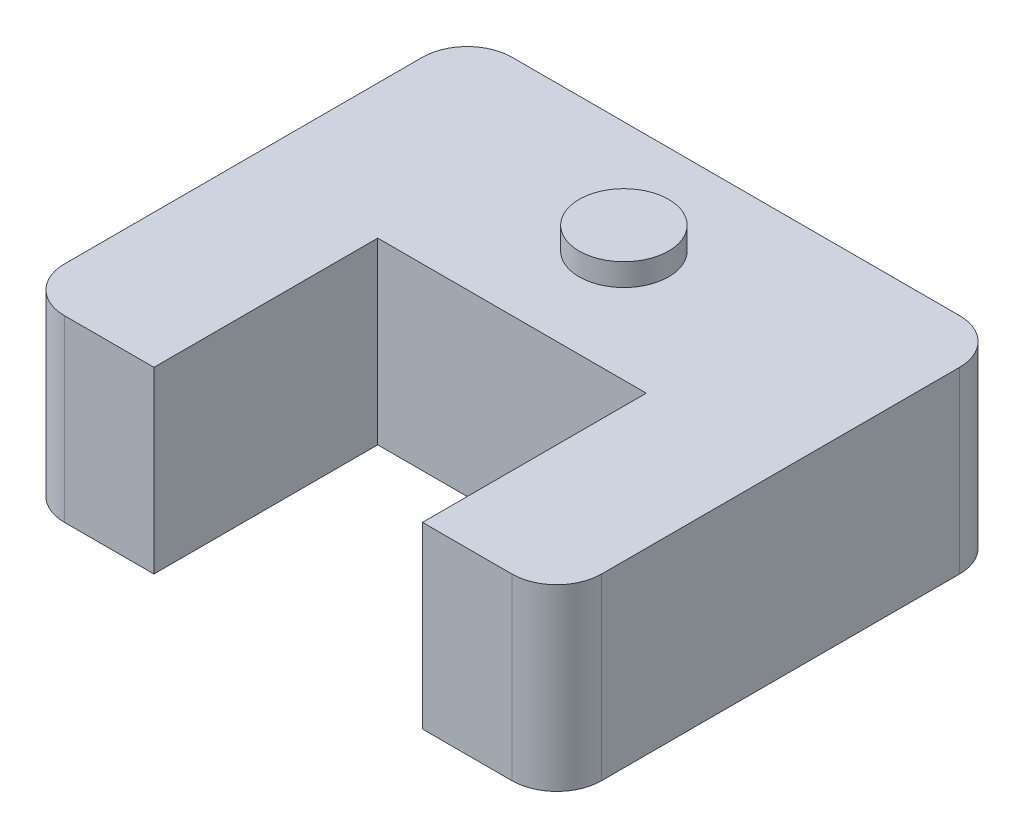
ISO-10303-21;
HEADER;
FILE_DESCRIPTION(('STEP AP214'),'2;1');
FILE_NAME('part.step','',(''),(''),'','','');
FILE_SCHEMA(('AUTOMOTIVE_DESIGN { 1 0 10303 214 1 1 1 1 }'));
ENDSEC;
DATA;
#1=APPLICATION_CONTEXT('core data for automotive mechanical design processes');
#2=APPLICATION_PROTOCOL_DEFINITION('international standard','automotive_design',2000,#1);
#3=PRODUCT_CONTEXT('',#1,'mechanical');
#4=PRODUCT('Part','Part','',(#3));
#5=PRODUCT_RELATED_PRODUCT_CATEGORY('part','',(#4));
#6=PRODUCT_DEFINITION_FORMATION('','',#4);
#7=PRODUCT_DEFINITION_CONTEXT('part definition',#1,'design');
#8=PRODUCT_DEFINITION('design','',#6,#7);
#9=PRODUCT_DEFINITION_SHAPE('','',#8);
#10=(LENGTH_UNIT() NAMED_UNIT(*) SI_UNIT(.MILLI.,.METRE.));
#11=(NAMED_UNIT(*) PLANE_ANGLE_UNIT() SI_UNIT($,.RADIAN.));
#12=(NAMED_UNIT(*) SI_UNIT($,.STERADIAN.) SOLID_ANGLE_UNIT());
#13=UNCERTAINTY_MEASURE_WITH_UNIT(LENGTH_MEASURE(1.E-05),#10,'distance_accuracy_value','');
#14=(GEOMETRIC_REPRESENTATION_CONTEXT(3) GLOBAL_UNCERTAINTY_ASSIGNED_CONTEXT((#13)) GLOBAL_UNIT_ASSIGNED_CONTEXT((#10,
#11,#12)) REPRESENTATION_CONTEXT('',''));
#15=CARTESIAN_POINT('',(0.,0.,0.));
#16=DIRECTION('',(0.,0.,1.));
#17=DIRECTION('',(1.,0.,0.));
#18=AXIS2_PLACEMENT_3D('',#15,#16,#17);
#19=CARTESIAN_POINT('',(0.,0.,0.));
#20=DIRECTION('',(0.,0.,-1.));
#21=DIRECTION('',(-1.,0.,0.));
#22=AXIS2_PLACEMENT_3D('',#19,#20,#21);
#23=PLANE('',#22);
#24=DIRECTION('',(-1.,0.,0.));
#25=VECTOR('',#24,1.);
#26=CARTESIAN_POINT('',(0.,101.6,0.));
#27=LINE('',#26,#25);
#28=CARTESIAN_POINT('',(-228.6,101.6,0.));
#29=VERTEX_POINT('',#28);
#30=CARTESIAN_POINT('',(-279.4,101.6,0.));
#31=VERTEX_POINT('',#30);
#32=EDGE_CURVE('E167',#29,#31,#27,.T.);
#33=ORIENTED_EDGE('',*,*,#32,.T.);
#34=DIRECTION('',(0.,1.,0.));
#35=VECTOR('',#34,1.);
#36=CARTESIAN_POINT('',(-279.4,0.,0.));
#37=LINE('',#36,#35);
#38=CARTESIAN_POINT('',(-279.4,0.,0.));
#39=VERTEX_POINT('',#38);
#40=EDGE_CURVE('E43',#31,#39,#37,.F.);
#41=ORIENTED_EDGE('',*,*,#40,.T.);
#42=DIRECTION('',(-1.,0.,0.));
#43=VECTOR('',#42,1.);
#44=CARTESIAN_POINT('',(0.,0.,0.));
#45=LINE('',#44,#43);
#46=CARTESIAN_POINT('',(-228.6,0.,0.));
#47=VERTEX_POINT('',#46);
#48=EDGE_CURVE('E182',#47,#39,#45,.T.);
#49=ORIENTED_EDGE('',*,*,#48,.F.);
#50=DIRECTION('',(0.,-1.,0.));
#51=VECTOR('',#50,1.);
#52=CARTESIAN_POINT('',(-228.6,0.,0.));
#53=LINE('',#52,#51);
#54=EDGE_CURVE('E136',#29,#47,#53,.T.);
#55=ORIENTED_EDGE('',*,*,#54,.F.);
#56=EDGE_LOOP('',(#33,#41,#49,#55));
#57=FACE_BOUND('',#56,.T.);
#58=ADVANCED_FACE('F39',(#57),#23,.F.);
#59=CARTESIAN_POINT('',(0.,101.6,-254.));
#60=DIRECTION('',(0.,1.,0.));
#61=DIRECTION('',(0.,0.,1.));
#62=AXIS2_PLACEMENT_3D('',#59,#60,#61);
#63=PLANE('',#62);
#64=CARTESIAN_POINT('',(-152.4,101.6,-190.5));
#65=DIRECTION('',(0.,1.,0.));
#66=DIRECTION('',(0.,0.,1.));
#67=AXIS2_PLACEMENT_3D('',#64,#65,#66);
#68=CIRCLE('',#67,25.4);
#69=CARTESIAN_POINT('',(-152.4,101.6,-165.1));
#70=VERTEX_POINT('',#69);
#71=EDGE_CURVE('E11',#70,#70,#68,.T.);
#72=ORIENTED_EDGE('',*,*,#71,.F.);
#73=EDGE_LOOP('',(#72));
#74=FACE_BOUND('',#73,.T.);
#75=DIRECTION('',(-1.,0.,0.));
#76=VECTOR('',#75,1.);
#77=CARTESIAN_POINT('',(0.,101.6,-254.));
#78=LINE('',#77,#76);
#79=CARTESIAN_POINT('',(-25.4,101.6,-254.));
#80=VERTEX_POINT('',#79);
#81=CARTESIAN_POINT('',(-279.4,101.6,-254.));
#82=VERTEX_POINT('',#81);
#83=EDGE_CURVE('E172',#80,#82,#78,.T.);
#84=ORIENTED_EDGE('',*,*,#83,.T.);
#85=CARTESIAN_POINT('',(-279.4,101.6,-228.6));
#86=DIRECTION('',(0.,1.,0.));
#87=DIRECTION('',(0.,0.,1.));
#88=AXIS2_PLACEMENT_3D('',#85,#86,#87);
#89=CIRCLE('',#88,25.4);
#90=CARTESIAN_POINT('',(-304.8,101.6,-228.6));
#91=VERTEX_POINT('',#90);
#92=EDGE_CURVE('E204',#82,#91,#89,.T.);
#93=ORIENTED_EDGE('',*,*,#92,.T.);
#94=DIRECTION('',(0.,0.,1.));
#95=VECTOR('',#94,1.);
#96=CARTESIAN_POINT('',(-304.8,101.6,-254.));
#97=LINE('',#96,#95);
#98=CARTESIAN_POINT('',(-304.8,101.6,-25.4));
#99=VERTEX_POINT('',#98);
#100=EDGE_CURVE('E179',#91,#99,#97,.T.);
#101=ORIENTED_EDGE('',*,*,#100,.T.);
#102=CARTESIAN_POINT('',(-279.4,101.6,-25.4));
#103=DIRECTION('',(0.,1.,0.));
#104=DIRECTION('',(0.,0.,1.));
#105=AXIS2_PLACEMENT_3D('',#102,#103,#104);
#106=CIRCLE('',#105,25.4);
#107=EDGE_CURVE('E198',#99,#31,#106,.T.);
#108=ORIENTED_EDGE('',*,*,#107,.T.);
#109=ORIENTED_EDGE('',*,*,#32,.F.);
#110=DIRECTION('',(0.,0.,1.));
#111=VECTOR('',#110,1.);
#112=CARTESIAN_POINT('',(-228.6,101.6,-127.));
#113=LINE('',#112,#111);
#114=CARTESIAN_POINT('',(-228.6,101.6,-127.));
#115=VERTEX_POINT('',#114);
#116=EDGE_CURVE('E165',#115,#29,#113,.T.);
#117=ORIENTED_EDGE('',*,*,#116,.F.);
#118=DIRECTION('',(-1.,0.,0.));
#119=VECTOR('',#118,1.);
#120=CARTESIAN_POINT('',(-228.6,101.6,-127.));
#121=LINE('',#120,#119);
#122=CARTESIAN_POINT('',(-76.2,101.6,-127.));
#123=VERTEX_POINT('',#122);
#124=EDGE_CURVE('E141',#123,#115,#121,.T.);
#125=ORIENTED_EDGE('',*,*,#124,.F.);
#126=DIRECTION('',(0.,0.,1.));
#127=VECTOR('',#126,1.);
#128=CARTESIAN_POINT('',(-76.2,101.6,-127.));
#129=LINE('',#128,#127);
#130=CARTESIAN_POINT('',(-76.2,101.6,0.));
#131=VERTEX_POINT('',#130);
#132=EDGE_CURVE('E168',#123,#131,#129,.T.);
#133=ORIENTED_EDGE('',*,*,#132,.T.);
#134=CARTESIAN_POINT('',(-25.4,101.6,0.));
#135=VERTEX_POINT('',#134);
#136=EDGE_CURVE('E180',#135,#131,#27,.T.);
#137=ORIENTED_EDGE('',*,*,#136,.F.);
#138=CARTESIAN_POINT('',(-25.4,101.6,-25.4));
#139=DIRECTION('',(0.,1.,0.));
#140=DIRECTION('',(0.,0.,1.));
#141=AXIS2_PLACEMENT_3D('',#138,#139,#140);
#142=CIRCLE('',#141,25.4);
#143=CARTESIAN_POINT('',(0.,101.6,-25.4));
#144=VERTEX_POINT('',#143);
#145=EDGE_CURVE('E200',#135,#144,#142,.T.);
#146=ORIENTED_EDGE('',*,*,#145,.T.);
#147=DIRECTION('',(0.,0.,1.));
#148=VECTOR('',#147,1.);
#149=CARTESIAN_POINT('',(0.,101.6,-254.));
#150=LINE('',#149,#148);
#151=CARTESIAN_POINT('',(0.,101.6,-228.6));
#152=VERTEX_POINT('',#151);
#153=EDGE_CURVE('E184',#152,#144,#150,.T.);
#154=ORIENTED_EDGE('',*,*,#153,.F.);
#155=CARTESIAN_POINT('',(-25.4,101.6,-228.6));
#156=DIRECTION('',(0.,1.,0.));
#157=DIRECTION('',(0.,0.,1.));
#158=AXIS2_PLACEMENT_3D('',#155,#156,#157);
#159=CIRCLE('',#158,25.4);
#160=EDGE_CURVE('E202',#152,#80,#159,.T.);
#161=ORIENTED_EDGE('',*,*,#160,.T.);
#162=EDGE_LOOP('',(#84,#93,#101,#108,#109,#117,#125,#133,#137,#146,#154,#161));
#163=FACE_BOUND('',#162,.T.);
#164=ADVANCED_FACE('F238',(#74,#163),#63,.T.);
#165=CARTESIAN_POINT('',(0.,0.,-254.));
#166=DIRECTION('',(1.,0.,0.));
#167=DIRECTION('',(0.,0.,-1.));
#168=AXIS2_PLACEMENT_3D('',#165,#166,#167);
#169=PLANE('',#168);
#170=DIRECTION('',(0.,0.,1.));
#171=VECTOR('',#170,1.);
#172=CARTESIAN_POINT('',(0.,0.,-254.));
#173=LINE('',#172,#171);
#174=CARTESIAN_POINT('',(0.,0.,-228.6));
#175=VERTEX_POINT('',#174);
#176=CARTESIAN_POINT('',(0.,0.,-25.4));
#177=VERTEX_POINT('',#176);
#178=EDGE_CURVE('E187',#175,#177,#173,.T.);
#179=ORIENTED_EDGE('',*,*,#178,.F.);
#180=DIRECTION('',(0.,1.,0.));
#181=VECTOR('',#180,1.);
#182=CARTESIAN_POINT('',(0.,0.,-228.6));
#183=LINE('',#182,#181);
#184=EDGE_CURVE('E219',#175,#152,#183,.T.);
#185=ORIENTED_EDGE('',*,*,#184,.T.);
#186=ORIENTED_EDGE('',*,*,#153,.T.);
#187=DIRECTION('',(0.,1.,0.));
#188=VECTOR('',#187,1.);
#189=CARTESIAN_POINT('',(0.,0.,-25.4));
#190=LINE('',#189,#188);
#191=EDGE_CURVE('E63',#144,#177,#190,.F.);
#192=ORIENTED_EDGE('',*,*,#191,.T.);
#193=EDGE_LOOP('',(#179,#185,#186,#192));
#194=FACE_BOUND('',#193,.T.);
#195=ADVANCED_FACE('F253',(#194),#169,.T.);
#196=CARTESIAN_POINT('',(0.,0.,-254.));
#197=DIRECTION('',(0.,1.,0.));
#198=DIRECTION('',(0.,0.,1.));
#199=AXIS2_PLACEMENT_3D('',#196,#197,#198);
#200=PLANE('',#199);
#201=DIRECTION('',(0.,0.,1.));
#202=VECTOR('',#201,1.);
#203=CARTESIAN_POINT('',(-304.8,0.,-254.));
#204=LINE('',#203,#202);
#205=CARTESIAN_POINT('',(-304.8,0.,-228.6));
#206=VERTEX_POINT('',#205);
#207=CARTESIAN_POINT('',(-304.8,0.,-25.4));
#208=VERTEX_POINT('',#207);
#209=EDGE_CURVE('E189',#206,#208,#204,.T.);
#210=ORIENTED_EDGE('',*,*,#209,.F.);
#211=CARTESIAN_POINT('',(-279.4,0.,-228.6));
#212=DIRECTION('',(0.,1.,0.));
#213=DIRECTION('',(0.,0.,1.));
#214=AXIS2_PLACEMENT_3D('',#211,#212,#213);
#215=CIRCLE('',#214,25.4);
#216=CARTESIAN_POINT('',(-279.4,0.,-254.));
#217=VERTEX_POINT('',#216);
#218=EDGE_CURVE('E216',#206,#217,#215,.F.);
#219=ORIENTED_EDGE('',*,*,#218,.T.);
#220=DIRECTION('',(-1.,0.,0.));
#221=VECTOR('',#220,1.);
#222=CARTESIAN_POINT('',(0.,0.,-254.));
#223=LINE('',#222,#221);
#224=CARTESIAN_POINT('',(-25.4,0.,-254.));
#225=VERTEX_POINT('',#224);
#226=EDGE_CURVE('E175',#225,#217,#223,.T.);
#227=ORIENTED_EDGE('',*,*,#226,.F.);
#228=CARTESIAN_POINT('',(-25.4,0.,-228.6));
#229=DIRECTION('',(0.,1.,0.));
#230=DIRECTION('',(0.,0.,1.));
#231=AXIS2_PLACEMENT_3D('',#228,#229,#230);
#232=CIRCLE('',#231,25.4);
#233=EDGE_CURVE('E214',#225,#175,#232,.F.);
#234=ORIENTED_EDGE('',*,*,#233,.T.);
#235=ORIENTED_EDGE('',*,*,#178,.T.);
#236=CARTESIAN_POINT('',(-25.4,0.,-25.4));
#237=DIRECTION('',(0.,1.,0.));
#238=DIRECTION('',(0.,0.,1.));
#239=AXIS2_PLACEMENT_3D('',#236,#237,#238);
#240=CIRCLE('',#239,25.4);
#241=CARTESIAN_POINT('',(-25.4,0.,0.));
#242=VERTEX_POINT('',#241);
#243=EDGE_CURVE('E55',#177,#242,#240,.F.);
#244=ORIENTED_EDGE('',*,*,#243,.T.);
#245=CARTESIAN_POINT('',(-76.2,0.,0.));
#246=VERTEX_POINT('',#245);
#247=EDGE_CURVE('E176',#242,#246,#45,.T.);
#248=ORIENTED_EDGE('',*,*,#247,.T.);
#249=DIRECTION('',(0.,0.,1.));
#250=VECTOR('',#249,1.);
#251=CARTESIAN_POINT('',(-76.2,0.,-127.));
#252=LINE('',#251,#250);
#253=CARTESIAN_POINT('',(-76.2,0.,-127.));
#254=VERTEX_POINT('',#253);
#255=EDGE_CURVE('E140',#254,#246,#252,.T.);
#256=ORIENTED_EDGE('',*,*,#255,.F.);
#257=DIRECTION('',(1.,0.,0.));
#258=VECTOR('',#257,1.);
#259=CARTESIAN_POINT('',(-228.6,0.,-127.));
#260=LINE('',#259,#258);
#261=CARTESIAN_POINT('',(-228.6,0.,-127.));
#262=VERTEX_POINT('',#261);
#263=EDGE_CURVE('E147',#262,#254,#260,.T.);
#264=ORIENTED_EDGE('',*,*,#263,.F.);
#265=DIRECTION('',(0.,0.,1.));
#266=VECTOR('',#265,1.);
#267=CARTESIAN_POINT('',(-228.6,0.,-127.));
#268=LINE('',#267,#266);
#269=EDGE_CURVE('E130',#262,#47,#268,.T.);
#270=ORIENTED_EDGE('',*,*,#269,.T.);
#271=ORIENTED_EDGE('',*,*,#48,.T.);
#272=CARTESIAN_POINT('',(-279.4,0.,-25.4));
#273=DIRECTION('',(0.,1.,0.));
#274=DIRECTION('',(0.,0.,1.));
#275=AXIS2_PLACEMENT_3D('',#272,#273,#274);
#276=CIRCLE('',#275,25.4);
#277=EDGE_CURVE('E211',#39,#208,#276,.F.);
#278=ORIENTED_EDGE('',*,*,#277,.T.);
#279=EDGE_LOOP('',(#210,#219,#227,#234,#235,#244,#248,#256,#264,#270,#271,#278));
#280=FACE_BOUND('',#279,.T.);
#281=ADVANCED_FACE('F154',(#280),#200,.F.);
#282=CARTESIAN_POINT('',(-304.8,0.,-254.));
#283=DIRECTION('',(1.,0.,0.));
#284=DIRECTION('',(0.,0.,-1.));
#285=AXIS2_PLACEMENT_3D('',#282,#283,#284);
#286=PLANE('',#285);
#287=ORIENTED_EDGE('',*,*,#100,.F.);
#288=DIRECTION('',(0.,1.,0.));
#289=VECTOR('',#288,1.);
#290=CARTESIAN_POINT('',(-304.8,0.,-228.6));
#291=LINE('',#290,#289);
#292=EDGE_CURVE('E209',#91,#206,#291,.F.);
#293=ORIENTED_EDGE('',*,*,#292,.T.);
#294=ORIENTED_EDGE('',*,*,#209,.T.);
#295=DIRECTION('',(0.,1.,0.));
#296=VECTOR('',#295,1.);
#297=CARTESIAN_POINT('',(-304.8,0.,-25.4));
#298=LINE('',#297,#296);
#299=EDGE_CURVE('E206',#208,#99,#298,.T.);
#300=ORIENTED_EDGE('',*,*,#299,.T.);
#301=EDGE_LOOP('',(#287,#293,#294,#300));
#302=FACE_BOUND('',#301,.T.);
#303=ADVANCED_FACE('F235',(#302),#286,.F.);
#304=CARTESIAN_POINT('',(0.,0.,-254.));
#305=DIRECTION('',(0.,0.,-1.));
#306=DIRECTION('',(-1.,0.,0.));
#307=AXIS2_PLACEMENT_3D('',#304,#305,#306);
#308=PLANE('',#307);
#309=ORIENTED_EDGE('',*,*,#226,.T.);
#310=DIRECTION('',(0.,1.,0.));
#311=VECTOR('',#310,1.);
#312=CARTESIAN_POINT('',(-279.4,101.6,-254.));
#313=LINE('',#312,#311);
#314=EDGE_CURVE('E195',#217,#82,#313,.T.);
#315=ORIENTED_EDGE('',*,*,#314,.T.);
#316=ORIENTED_EDGE('',*,*,#83,.F.);
#317=DIRECTION('',(0.,1.,0.));
#318=VECTOR('',#317,1.);
#319=CARTESIAN_POINT('',(-25.4,0.,-254.));
#320=LINE('',#319,#318);
#321=EDGE_CURVE('E186',#80,#225,#320,.F.);
#322=ORIENTED_EDGE('',*,*,#321,.T.);
#323=EDGE_LOOP('',(#309,#315,#316,#322));
#324=FACE_BOUND('',#323,.T.);
#325=ADVANCED_FACE('F245',(#324),#308,.T.);
#326=ORIENTED_EDGE('',*,*,#247,.F.);
#327=DIRECTION('',(0.,1.,0.));
#328=VECTOR('',#327,1.);
#329=CARTESIAN_POINT('',(-25.4,101.6,0.));
#330=LINE('',#329,#328);
#331=EDGE_CURVE('E221',#242,#135,#330,.T.);
#332=ORIENTED_EDGE('',*,*,#331,.T.);
#333=ORIENTED_EDGE('',*,*,#136,.T.);
#334=DIRECTION('',(0.,1.,0.));
#335=VECTOR('',#334,1.);
#336=CARTESIAN_POINT('',(-76.2,0.,0.));
#337=LINE('',#336,#335);
#338=EDGE_CURVE('E151',#246,#131,#337,.T.);
#339=ORIENTED_EDGE('',*,*,#338,.F.);
#340=EDGE_LOOP('',(#326,#332,#333,#339));
#341=FACE_BOUND('',#340,.T.);
#342=ADVANCED_FACE('F265',(#341),#23,.F.);
#343=CARTESIAN_POINT('',(-228.6,0.,-127.));
#344=DIRECTION('',(-1.,0.,0.));
#345=DIRECTION('',(0.,0.,1.));
#346=AXIS2_PLACEMENT_3D('',#343,#344,#345);
#347=PLANE('',#346);
#348=ORIENTED_EDGE('',*,*,#54,.T.);
#349=ORIENTED_EDGE('',*,*,#269,.F.);
#350=DIRECTION('',(0.,-1.,0.));
#351=VECTOR('',#350,1.);
#352=CARTESIAN_POINT('',(-228.6,0.,-127.));
#353=LINE('',#352,#351);
#354=EDGE_CURVE('E133',#115,#262,#353,.T.);
#355=ORIENTED_EDGE('',*,*,#354,.F.);
#356=ORIENTED_EDGE('',*,*,#116,.T.);
#357=EDGE_LOOP('',(#348,#349,#355,#356));
#358=FACE_BOUND('',#357,.T.);
#359=ADVANCED_FACE('F132',(#358),#347,.F.);
#360=CARTESIAN_POINT('',(-76.2,0.,-127.));
#361=DIRECTION('',(1.,0.,0.));
#362=DIRECTION('',(0.,0.,-1.));
#363=AXIS2_PLACEMENT_3D('',#360,#361,#362);
#364=PLANE('',#363);
#365=ORIENTED_EDGE('',*,*,#338,.T.);
#366=ORIENTED_EDGE('',*,*,#132,.F.);
#367=DIRECTION('',(0.,1.,0.));
#368=VECTOR('',#367,1.);
#369=CARTESIAN_POINT('',(-76.2,0.,-127.));
#370=LINE('',#369,#368);
#371=EDGE_CURVE('E156',#254,#123,#370,.T.);
#372=ORIENTED_EDGE('',*,*,#371,.F.);
#373=ORIENTED_EDGE('',*,*,#255,.T.);
#374=EDGE_LOOP('',(#365,#366,#372,#373));
#375=FACE_BOUND('',#374,.T.);
#376=ADVANCED_FACE('F281',(#375),#364,.F.);
#377=CARTESIAN_POINT('',(0.,0.,-127.));
#378=DIRECTION('',(0.,0.,-1.));
#379=DIRECTION('',(-1.,0.,0.));
#380=AXIS2_PLACEMENT_3D('',#377,#378,#379);
#381=PLANE('',#380);
#382=ORIENTED_EDGE('',*,*,#354,.T.);
#383=ORIENTED_EDGE('',*,*,#263,.T.);
#384=ORIENTED_EDGE('',*,*,#371,.T.);
#385=ORIENTED_EDGE('',*,*,#124,.T.);
#386=EDGE_LOOP('',(#382,#383,#384,#385));
#387=FACE_BOUND('',#386,.T.);
#388=ADVANCED_FACE('F145',(#387),#381,.F.);
#389=CARTESIAN_POINT('',(-279.4,0.,-228.6));
#390=DIRECTION('',(0.,-1.,0.));
#391=DIRECTION('',(0.,0.,-1.));
#392=AXIS2_PLACEMENT_3D('',#389,#390,#391);
#393=CYLINDRICAL_SURFACE('',#392,25.4);
#394=ORIENTED_EDGE('',*,*,#218,.F.);
#395=ORIENTED_EDGE('',*,*,#292,.F.);
#396=ORIENTED_EDGE('',*,*,#92,.F.);
#397=ORIENTED_EDGE('',*,*,#314,.F.);
#398=EDGE_LOOP('',(#394,#395,#396,#397));
#399=FACE_BOUND('',#398,.T.);
#400=ADVANCED_FACE('F243',(#399),#393,.T.);
#401=CARTESIAN_POINT('',(-25.4,0.,-228.6));
#402=DIRECTION('',(0.,1.,0.));
#403=DIRECTION('',(0.,0.,1.));
#404=AXIS2_PLACEMENT_3D('',#401,#402,#403);
#405=CYLINDRICAL_SURFACE('',#404,25.4);
#406=ORIENTED_EDGE('',*,*,#233,.F.);
#407=ORIENTED_EDGE('',*,*,#321,.F.);
#408=ORIENTED_EDGE('',*,*,#160,.F.);
#409=ORIENTED_EDGE('',*,*,#184,.F.);
#410=EDGE_LOOP('',(#406,#407,#408,#409));
#411=FACE_BOUND('',#410,.T.);
#412=ADVANCED_FACE('F251',(#411),#405,.T.);
#413=CARTESIAN_POINT('',(-25.4,0.,-25.4));
#414=DIRECTION('',(0.,-1.,0.));
#415=DIRECTION('',(0.,0.,-1.));
#416=AXIS2_PLACEMENT_3D('',#413,#414,#415);
#417=CYLINDRICAL_SURFACE('',#416,25.4);
#418=ORIENTED_EDGE('',*,*,#243,.F.);
#419=ORIENTED_EDGE('',*,*,#191,.F.);
#420=ORIENTED_EDGE('',*,*,#145,.F.);
#421=ORIENTED_EDGE('',*,*,#331,.F.);
#422=EDGE_LOOP('',(#418,#419,#420,#421));
#423=FACE_BOUND('',#422,.T.);
#424=ADVANCED_FACE('F255',(#423),#417,.T.);
#425=CARTESIAN_POINT('',(-279.4,0.,-25.4));
#426=DIRECTION('',(0.,1.,0.));
#427=DIRECTION('',(0.,0.,1.));
#428=AXIS2_PLACEMENT_3D('',#425,#426,#427);
#429=CYLINDRICAL_SURFACE('',#428,25.4);
#430=ORIENTED_EDGE('',*,*,#277,.F.);
#431=ORIENTED_EDGE('',*,*,#40,.F.);
#432=ORIENTED_EDGE('',*,*,#107,.F.);
#433=ORIENTED_EDGE('',*,*,#299,.F.);
#434=EDGE_LOOP('',(#430,#431,#432,#433));
#435=FACE_BOUND('',#434,.T.);
#436=ADVANCED_FACE('F41',(#435),#429,.T.);
#437=CARTESIAN_POINT('',(-152.4,114.3,-190.5));
#438=DIRECTION('',(0.,-1.,0.));
#439=DIRECTION('',(0.,0.,-1.));
#440=AXIS2_PLACEMENT_3D('',#437,#438,#439);
#441=CYLINDRICAL_SURFACE('',#440,25.4);
#442=CARTESIAN_POINT('',(-152.4,114.3,-190.5));
#443=DIRECTION('',(0.,1.,0.));
#444=DIRECTION('',(0.,0.,1.));
#445=AXIS2_PLACEMENT_3D('',#442,#443,#444);
#446=CIRCLE('',#445,25.4);
#447=CARTESIAN_POINT('',(-152.4,114.3,-165.1));
#448=VERTEX_POINT('',#447);
#449=EDGE_CURVE('E162',#448,#448,#446,.T.);
#450=ORIENTED_EDGE('',*,*,#449,.F.);
#451=EDGE_LOOP('',(#450));
#452=FACE_BOUND('',#451,.T.);
#453=ORIENTED_EDGE('',*,*,#71,.T.);
#454=EDGE_LOOP('',(#453));
#455=FACE_BOUND('',#454,.T.);
#456=ADVANCED_FACE('F261',(#452,#455),#441,.T.);
#457=CARTESIAN_POINT('',(-152.4,114.3,-190.5));
#458=DIRECTION('',(0.,1.,0.));
#459=DIRECTION('',(0.,0.,1.));
#460=AXIS2_PLACEMENT_3D('',#457,#458,#459);
#461=PLANE('',#460);
#462=ORIENTED_EDGE('',*,*,#449,.T.);
#463=EDGE_LOOP('',(#462));
#464=FACE_BOUND('',#463,.T.);
#465=ADVANCED_FACE('F293',(#464),#461,.T.);
#466=CLOSED_SHELL('',(#58,#164,#195,#281,#303,#325,#342,#359,#376,#388,#400,#412,#424,#436,#456,#465));
#467=MANIFOLD_SOLID_BREP('B2',#466);
#468=ADVANCED_BREP_SHAPE_REPRESENTATION('',(#18,#467),#14);
#469=SHAPE_DEFINITION_REPRESENTATION(#9,#468);
ENDSEC;
END-ISO-10303-21;
